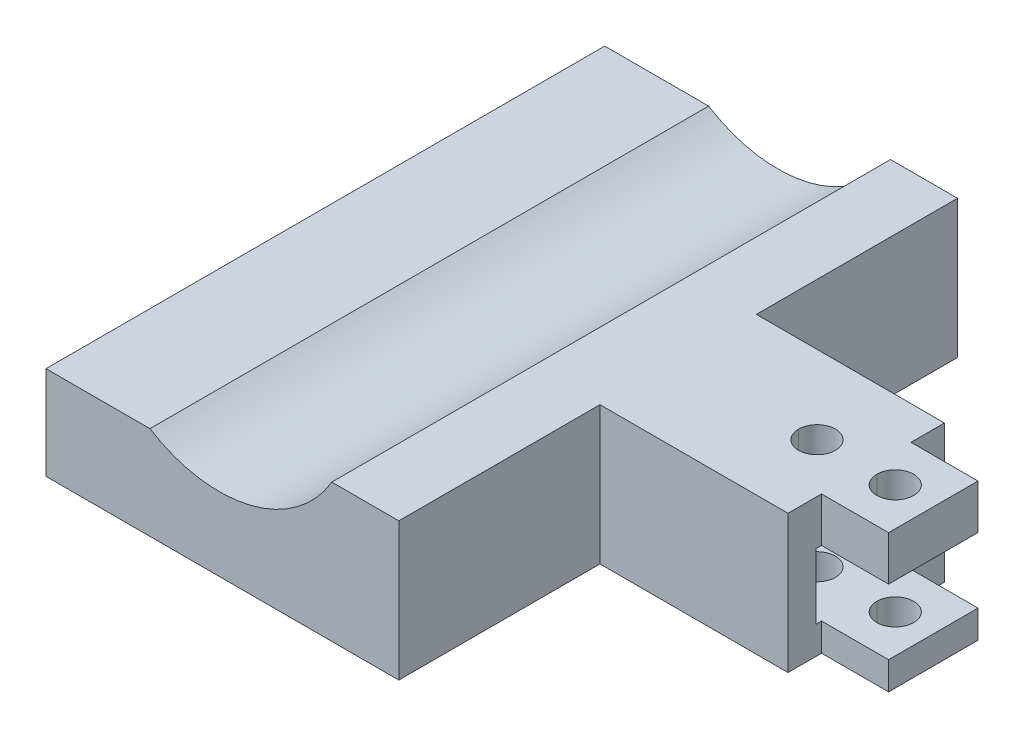
ISO-10303-21;
HEADER;
FILE_DESCRIPTION(('STEP AP214'),'2;1');
FILE_NAME('part.step','',(''),(''),'','','');
FILE_SCHEMA(('AUTOMOTIVE_DESIGN { 1 0 10303 214 1 1 1 1 }'));
ENDSEC;
DATA;
#1=APPLICATION_CONTEXT('core data for automotive mechanical design processes');
#2=APPLICATION_PROTOCOL_DEFINITION('international standard','automotive_design',2000,#1);
#3=PRODUCT_CONTEXT('',#1,'mechanical');
#4=PRODUCT('Part','Part','',(#3));
#5=PRODUCT_RELATED_PRODUCT_CATEGORY('part','',(#4));
#6=PRODUCT_DEFINITION_FORMATION('','',#4);
#7=PRODUCT_DEFINITION_CONTEXT('part definition',#1,'design');
#8=PRODUCT_DEFINITION('design','',#6,#7);
#9=PRODUCT_DEFINITION_SHAPE('','',#8);
#10=(LENGTH_UNIT() NAMED_UNIT(*) SI_UNIT(.MILLI.,.METRE.));
#11=(NAMED_UNIT(*) PLANE_ANGLE_UNIT() SI_UNIT($,.RADIAN.));
#12=(NAMED_UNIT(*) SI_UNIT($,.STERADIAN.) SOLID_ANGLE_UNIT());
#13=UNCERTAINTY_MEASURE_WITH_UNIT(LENGTH_MEASURE(1.E-05),#10,'distance_accuracy_value','');
#14=(GEOMETRIC_REPRESENTATION_CONTEXT(3) GLOBAL_UNCERTAINTY_ASSIGNED_CONTEXT((#13)) GLOBAL_UNIT_ASSIGNED_CONTEXT((#10,
#11,#12)) REPRESENTATION_CONTEXT('',''));
#15=CARTESIAN_POINT('',(0.,0.,0.));
#16=DIRECTION('',(0.,0.,1.));
#17=DIRECTION('',(1.,0.,0.));
#18=AXIS2_PLACEMENT_3D('',#15,#16,#17);
#19=CARTESIAN_POINT('',(-92.8945354558138,73.7864055622009,218.611735270425));
#20=DIRECTION('',(-1.,0.,0.));
#21=DIRECTION('',(0.,1.,0.));
#22=AXIS2_PLACEMENT_3D('',#19,#20,#21);
#23=PLANE('',#22);
#24=DIRECTION('',(0.,0.,1.));
#25=VECTOR('',#24,1.);
#26=CARTESIAN_POINT('',(-92.8945354558138,80.7864055622009,148.611735270425));
#27=LINE('',#26,#25);
#28=CARTESIAN_POINT('',(-92.8945354558149,80.7864055622009,189.611735270425));
#29=VERTEX_POINT('',#28);
#30=CARTESIAN_POINT('',(-92.8945354558138,80.7864055622009,197.611735270425));
#31=VERTEX_POINT('',#30);
#32=EDGE_CURVE('E314',#29,#31,#27,.T.);
#33=ORIENTED_EDGE('',*,*,#32,.F.);
#34=DIRECTION('',(0.,1.,0.));
#35=VECTOR('',#34,1.);
#36=CARTESIAN_POINT('',(-92.8945354558149,49.765319824315,189.611735270425));
#37=LINE('',#36,#35);
#38=CARTESIAN_POINT('',(-92.8945354558149,83.2834127928238,189.611735270425));
#39=VERTEX_POINT('',#38);
#40=EDGE_CURVE('E294',#29,#39,#37,.T.);
#41=ORIENTED_EDGE('',*,*,#40,.T.);
#42=DIRECTION('',(0.,0.,1.));
#43=VECTOR('',#42,1.);
#44=CARTESIAN_POINT('',(-92.8945354558138,83.2834127928238,218.611735270425));
#45=LINE('',#44,#43);
#46=CARTESIAN_POINT('',(-92.8945354558149,83.2834127928238,197.611735270425));
#47=VERTEX_POINT('',#46);
#48=EDGE_CURVE('E329',#39,#47,#45,.T.);
#49=ORIENTED_EDGE('',*,*,#48,.T.);
#50=DIRECTION('',(0.,1.,0.));
#51=VECTOR('',#50,1.);
#52=CARTESIAN_POINT('',(-92.8945354558149,49.765319824315,197.611735270425));
#53=LINE('',#52,#51);
#54=EDGE_CURVE('E320',#31,#47,#53,.T.);
#55=ORIENTED_EDGE('',*,*,#54,.F.);
#56=EDGE_LOOP('',(#33,#41,#49,#55));
#57=FACE_BOUND('',#56,.T.);
#58=ADVANCED_FACE('F53',(#57),#23,.F.);
#59=CARTESIAN_POINT('',(-109.894535455814,0.,0.));
#60=DIRECTION('',(1.,0.,0.));
#61=DIRECTION('',(0.,1.,0.));
#62=AXIS2_PLACEMENT_3D('',#59,#60,#61);
#63=PLANE('',#62);
#64=DIRECTION('',(0.,0.,1.));
#65=VECTOR('',#64,1.);
#66=CARTESIAN_POINT('',(-109.894535455814,83.2834127928238,218.611735270425));
#67=LINE('',#66,#65);
#68=CARTESIAN_POINT('',(-109.894535455814,83.2834127928238,189.118407463963));
#69=VERTEX_POINT('',#68);
#70=CARTESIAN_POINT('',(-109.894535455814,83.2834127928238,198.118407463963));
#71=VERTEX_POINT('',#70);
#72=EDGE_CURVE('E399',#69,#71,#67,.T.);
#73=ORIENTED_EDGE('',*,*,#72,.F.);
#74=DIRECTION('',(0.,-1.,0.));
#75=VECTOR('',#74,1.);
#76=CARTESIAN_POINT('',(-109.894535455814,73.7864055622009,189.118407463963));
#77=LINE('',#76,#75);
#78=CARTESIAN_POINT('',(-109.894535455814,89.1366751406176,189.118407463963));
#79=VERTEX_POINT('',#78);
#80=EDGE_CURVE('E346',#79,#69,#77,.T.);
#81=ORIENTED_EDGE('',*,*,#80,.F.);
#82=DIRECTION('',(0.,0.,-1.));
#83=VECTOR('',#82,1.);
#84=CARTESIAN_POINT('',(-109.894535455814,89.1366751406176,218.611735270425));
#85=LINE('',#84,#83);
#86=CARTESIAN_POINT('',(-109.894535455814,89.1366751406176,198.118407463963));
#87=VERTEX_POINT('',#86);
#88=EDGE_CURVE('E347',#87,#79,#85,.T.);
#89=ORIENTED_EDGE('',*,*,#88,.F.);
#90=DIRECTION('',(0.,-1.,0.));
#91=VECTOR('',#90,1.);
#92=CARTESIAN_POINT('',(-109.894535455814,73.7864055622009,198.118407463963));
#93=LINE('',#92,#91);
#94=EDGE_CURVE('E500',#87,#71,#93,.T.);
#95=ORIENTED_EDGE('',*,*,#94,.T.);
#96=EDGE_LOOP('',(#73,#81,#89,#95));
#97=FACE_BOUND('',#96,.T.);
#98=ADVANCED_FACE('F55',(#97),#63,.T.);
#99=CARTESIAN_POINT('',(-109.894535455814,73.7864055622009,189.118407463963));
#100=DIRECTION('',(0.,0.,1.));
#101=DIRECTION('',(1.,0.,0.));
#102=AXIS2_PLACEMENT_3D('',#99,#100,#101);
#103=PLANE('',#102);
#104=DIRECTION('',(0.,-1.,0.));
#105=VECTOR('',#104,1.);
#106=CARTESIAN_POINT('',(-98.8945354558149,73.7864055622009,189.118407463963));
#107=LINE('',#106,#105);
#108=CARTESIAN_POINT('',(-98.8945354558149,89.1366751406176,189.118407463963));
#109=VERTEX_POINT('',#108);
#110=CARTESIAN_POINT('',(-98.8945354558149,83.2834127928238,189.118407463963));
#111=VERTEX_POINT('',#110);
#112=EDGE_CURVE('E614',#109,#111,#107,.T.);
#113=ORIENTED_EDGE('',*,*,#112,.F.);
#114=DIRECTION('',(1.,0.,0.));
#115=VECTOR('',#114,1.);
#116=CARTESIAN_POINT('',(-109.894535455814,89.1366751406176,189.118407463963));
#117=LINE('',#116,#115);
#118=EDGE_CURVE('E342',#79,#109,#117,.T.);
#119=ORIENTED_EDGE('',*,*,#118,.F.);
#120=ORIENTED_EDGE('',*,*,#80,.T.);
#121=DIRECTION('',(1.,0.,0.));
#122=VECTOR('',#121,1.);
#123=CARTESIAN_POINT('',(-109.894535455814,83.2834127928238,189.118407463963));
#124=LINE('',#123,#122);
#125=EDGE_CURVE('E395',#69,#111,#124,.T.);
#126=ORIENTED_EDGE('',*,*,#125,.T.);
#127=EDGE_LOOP('',(#113,#119,#120,#126));
#128=FACE_BOUND('',#127,.T.);
#129=ADVANCED_FACE('F550',(#128),#103,.T.);
#130=CARTESIAN_POINT('',(-109.894535455814,89.1366751406176,218.611735270425));
#131=DIRECTION('',(0.,-1.,0.));
#132=DIRECTION('',(0.,0.,-1.));
#133=AXIS2_PLACEMENT_3D('',#130,#131,#132);
#134=PLANE('',#133);
#135=DIRECTION('',(-1.,0.,0.));
#136=VECTOR('',#135,1.);
#137=CARTESIAN_POINT('',(-109.894535455814,89.1366751406176,189.611735270425));
#138=LINE('',#137,#136);
#139=CARTESIAN_POINT('',(-92.8945354558149,89.1366751406176,189.611735270425));
#140=VERTEX_POINT('',#139);
#141=CARTESIAN_POINT('',(-98.8945354558149,89.1366751406176,189.611735270425));
#142=VERTEX_POINT('',#141);
#143=EDGE_CURVE('E592',#140,#142,#138,.T.);
#144=ORIENTED_EDGE('',*,*,#143,.F.);
#145=DIRECTION('',(0.,0.,-1.));
#146=VECTOR('',#145,1.);
#147=CARTESIAN_POINT('',(-92.8945354558138,89.1366751406176,218.611735270425));
#148=LINE('',#147,#146);
#149=CARTESIAN_POINT('',(-92.8945354558149,89.1366751406176,197.611735270425));
#150=VERTEX_POINT('',#149);
#151=EDGE_CURVE('E428',#150,#140,#148,.T.);
#152=ORIENTED_EDGE('',*,*,#151,.F.);
#153=DIRECTION('',(1.,0.,0.));
#154=VECTOR('',#153,1.);
#155=CARTESIAN_POINT('',(-109.894535455814,89.1366751406176,197.611735270425));
#156=LINE('',#155,#154);
#157=CARTESIAN_POINT('',(-98.8945354558149,89.1366751406176,197.611735270425));
#158=VERTEX_POINT('',#157);
#159=EDGE_CURVE('E590',#158,#150,#156,.T.);
#160=ORIENTED_EDGE('',*,*,#159,.F.);
#161=DIRECTION('',(0.,0.,-1.));
#162=VECTOR('',#161,1.);
#163=CARTESIAN_POINT('',(-98.8945354558149,89.1366751406176,218.611735270425));
#164=LINE('',#163,#162);
#165=CARTESIAN_POINT('',(-98.8945354558149,89.1366751406176,198.118407463963));
#166=VERTEX_POINT('',#165);
#167=EDGE_CURVE('E608',#166,#158,#164,.T.);
#168=ORIENTED_EDGE('',*,*,#167,.F.);
#169=DIRECTION('',(1.,0.,0.));
#170=VECTOR('',#169,1.);
#171=CARTESIAN_POINT('',(-109.894535455814,89.1366751406176,198.118407463963));
#172=LINE('',#171,#170);
#173=EDGE_CURVE('E503',#87,#166,#172,.T.);
#174=ORIENTED_EDGE('',*,*,#173,.F.);
#175=ORIENTED_EDGE('',*,*,#88,.T.);
#176=ORIENTED_EDGE('',*,*,#118,.T.);
#177=DIRECTION('',(0.,0.,-1.));
#178=VECTOR('',#177,1.);
#179=CARTESIAN_POINT('',(-98.8945354558149,89.1366751406176,218.611735270425));
#180=LINE('',#179,#178);
#181=EDGE_CURVE('E593',#142,#109,#180,.T.);
#182=ORIENTED_EDGE('',*,*,#181,.F.);
#183=EDGE_LOOP('',(#144,#152,#160,#168,#174,#175,#176,#182));
#184=FACE_BOUND('',#183,.T.);
#185=CARTESIAN_POINT('',(-103.3,89.1366751406176,193.611735270425));
#186=DIRECTION('',(0.,-1.,0.));
#187=DIRECTION('',(1.,0.,0.));
#188=AXIS2_PLACEMENT_3D('',#185,#186,#187);
#189=CIRCLE('',#188,1.65);
#190=CARTESIAN_POINT('',(-104.95,89.1366751406176,193.611735270425));
#191=VERTEX_POINT('',#190);
#192=CARTESIAN_POINT('',(-101.65,89.1366751406176,193.611735270425));
#193=VERTEX_POINT('',#192);
#194=EDGE_CURVE('E336',#191,#193,#189,.T.);
#195=ORIENTED_EDGE('',*,*,#194,.F.);
#196=CARTESIAN_POINT('',(-103.3,89.1366751406176,193.611735270425));
#197=DIRECTION('',(0.,-1.,0.));
#198=DIRECTION('',(1.,0.,0.));
#199=AXIS2_PLACEMENT_3D('',#196,#197,#198);
#200=CIRCLE('',#199,1.65);
#201=EDGE_CURVE('E445',#193,#191,#200,.T.);
#202=ORIENTED_EDGE('',*,*,#201,.F.);
#203=EDGE_LOOP('',(#195,#202));
#204=FACE_BOUND('',#203,.T.);
#205=CARTESIAN_POINT('',(-96.3,89.1366751406176,193.611735270425));
#206=DIRECTION('',(0.,-1.,0.));
#207=DIRECTION('',(1.,0.,0.));
#208=AXIS2_PLACEMENT_3D('',#205,#206,#207);
#209=CIRCLE('',#208,1.65);
#210=CARTESIAN_POINT('',(-97.95,89.1366751406176,193.611735270425));
#211=VERTEX_POINT('',#210);
#212=CARTESIAN_POINT('',(-94.65,89.1366751406176,193.611735270425));
#213=VERTEX_POINT('',#212);
#214=EDGE_CURVE('E387',#211,#213,#209,.T.);
#215=ORIENTED_EDGE('',*,*,#214,.F.);
#216=CARTESIAN_POINT('',(-96.3,89.1366751406176,193.611735270425));
#217=DIRECTION('',(0.,-1.,0.));
#218=DIRECTION('',(1.,0.,0.));
#219=AXIS2_PLACEMENT_3D('',#216,#217,#218);
#220=CIRCLE('',#219,1.65);
#221=EDGE_CURVE('E412',#213,#211,#220,.T.);
#222=ORIENTED_EDGE('',*,*,#221,.F.);
#223=EDGE_LOOP('',(#215,#222));
#224=FACE_BOUND('',#223,.T.);
#225=ADVANCED_FACE('F547',(#184,#204,#224),#134,.T.);
#226=CARTESIAN_POINT('',(-109.894535455814,73.7864055622009,198.118407463963));
#227=DIRECTION('',(0.,0.,1.));
#228=DIRECTION('',(1.,0.,0.));
#229=AXIS2_PLACEMENT_3D('',#226,#227,#228);
#230=PLANE('',#229);
#231=ORIENTED_EDGE('',*,*,#173,.T.);
#232=DIRECTION('',(0.,-1.,0.));
#233=VECTOR('',#232,1.);
#234=CARTESIAN_POINT('',(-98.8945354558149,73.7864055622009,198.118407463963));
#235=LINE('',#234,#233);
#236=CARTESIAN_POINT('',(-98.8945354558149,83.2834127928238,198.118407463963));
#237=VERTEX_POINT('',#236);
#238=EDGE_CURVE('E600',#166,#237,#235,.T.);
#239=ORIENTED_EDGE('',*,*,#238,.T.);
#240=DIRECTION('',(1.,0.,0.));
#241=VECTOR('',#240,1.);
#242=CARTESIAN_POINT('',(-109.894535455814,83.2834127928238,198.118407463963));
#243=LINE('',#242,#241);
#244=EDGE_CURVE('E496',#71,#237,#243,.T.);
#245=ORIENTED_EDGE('',*,*,#244,.F.);
#246=ORIENTED_EDGE('',*,*,#94,.F.);
#247=EDGE_LOOP('',(#231,#239,#245,#246));
#248=FACE_BOUND('',#247,.T.);
#249=ADVANCED_FACE('F543',(#248),#230,.F.);
#250=CARTESIAN_POINT('',(-109.894535455814,83.2834127928238,218.611735270425));
#251=DIRECTION('',(0.,1.,0.));
#252=DIRECTION('',(1.,0.,0.));
#253=AXIS2_PLACEMENT_3D('',#250,#251,#252);
#254=PLANE('',#253);
#255=DIRECTION('',(1.,0.,0.));
#256=VECTOR('',#255,1.);
#257=CARTESIAN_POINT('',(-109.894535455814,83.2834127928238,189.611735270425));
#258=LINE('',#257,#256);
#259=CARTESIAN_POINT('',(-98.8945354558149,83.2834127928238,189.611735270425));
#260=VERTEX_POINT('',#259);
#261=EDGE_CURVE('E301',#260,#39,#258,.T.);
#262=ORIENTED_EDGE('',*,*,#261,.F.);
#263=DIRECTION('',(0.,0.,1.));
#264=VECTOR('',#263,1.);
#265=CARTESIAN_POINT('',(-98.8945354558149,83.2834127928238,218.611735270425));
#266=LINE('',#265,#264);
#267=EDGE_CURVE('E611',#111,#260,#266,.T.);
#268=ORIENTED_EDGE('',*,*,#267,.F.);
#269=ORIENTED_EDGE('',*,*,#125,.F.);
#270=ORIENTED_EDGE('',*,*,#72,.T.);
#271=ORIENTED_EDGE('',*,*,#244,.T.);
#272=DIRECTION('',(0.,0.,1.));
#273=VECTOR('',#272,1.);
#274=CARTESIAN_POINT('',(-98.8945354558149,83.2834127928238,218.611735270425));
#275=LINE('',#274,#273);
#276=CARTESIAN_POINT('',(-98.8945354558149,83.2834127928238,197.611735270425));
#277=VERTEX_POINT('',#276);
#278=EDGE_CURVE('E596',#277,#237,#275,.T.);
#279=ORIENTED_EDGE('',*,*,#278,.F.);
#280=DIRECTION('',(-1.,0.,0.));
#281=VECTOR('',#280,1.);
#282=CARTESIAN_POINT('',(-109.894535455814,83.2834127928238,197.611735270425));
#283=LINE('',#282,#281);
#284=EDGE_CURVE('E663',#47,#277,#283,.T.);
#285=ORIENTED_EDGE('',*,*,#284,.F.);
#286=ORIENTED_EDGE('',*,*,#48,.F.);
#287=EDGE_LOOP('',(#262,#268,#269,#270,#271,#279,#285,#286));
#288=FACE_BOUND('',#287,.T.);
#289=CARTESIAN_POINT('',(-103.3,83.2834127928238,193.611735270425));
#290=DIRECTION('',(0.,1.,0.));
#291=DIRECTION('',(-1.,0.,0.));
#292=AXIS2_PLACEMENT_3D('',#289,#290,#291);
#293=CIRCLE('',#292,1.65);
#294=CARTESIAN_POINT('',(-104.95,83.2834127928238,193.611735270425));
#295=VERTEX_POINT('',#294);
#296=CARTESIAN_POINT('',(-101.65,83.2834127928238,193.611735270425));
#297=VERTEX_POINT('',#296);
#298=EDGE_CURVE('E442',#295,#297,#293,.T.);
#299=ORIENTED_EDGE('',*,*,#298,.F.);
#300=CARTESIAN_POINT('',(-103.3,83.2834127928238,193.611735270425));
#301=DIRECTION('',(0.,1.,0.));
#302=DIRECTION('',(-1.,0.,0.));
#303=AXIS2_PLACEMENT_3D('',#300,#301,#302);
#304=CIRCLE('',#303,1.65);
#305=EDGE_CURVE('E357',#297,#295,#304,.T.);
#306=ORIENTED_EDGE('',*,*,#305,.F.);
#307=EDGE_LOOP('',(#299,#306));
#308=FACE_BOUND('',#307,.T.);
#309=CARTESIAN_POINT('',(-96.3,83.2834127928238,193.611735270425));
#310=DIRECTION('',(0.,1.,0.));
#311=DIRECTION('',(-1.,0.,0.));
#312=AXIS2_PLACEMENT_3D('',#309,#310,#311);
#313=CIRCLE('',#312,1.65);
#314=CARTESIAN_POINT('',(-97.95,83.2834127928238,193.611735270425));
#315=VERTEX_POINT('',#314);
#316=CARTESIAN_POINT('',(-94.65,83.2834127928238,193.611735270425));
#317=VERTEX_POINT('',#316);
#318=EDGE_CURVE('E441',#315,#317,#313,.T.);
#319=ORIENTED_EDGE('',*,*,#318,.F.);
#320=CARTESIAN_POINT('',(-96.3,83.2834127928238,193.611735270425));
#321=DIRECTION('',(0.,1.,0.));
#322=DIRECTION('',(-1.,0.,0.));
#323=AXIS2_PLACEMENT_3D('',#320,#321,#322);
#324=CIRCLE('',#323,1.65);
#325=EDGE_CURVE('E332',#317,#315,#324,.T.);
#326=ORIENTED_EDGE('',*,*,#325,.F.);
#327=EDGE_LOOP('',(#319,#326));
#328=FACE_BOUND('',#327,.T.);
#329=ADVANCED_FACE('F540',(#288,#308,#328),#254,.T.);
#330=CARTESIAN_POINT('',(-92.8945354558138,80.7864055622009,148.611735270425));
#331=DIRECTION('',(0.,-1.,0.));
#332=DIRECTION('',(0.,0.,-1.));
#333=AXIS2_PLACEMENT_3D('',#330,#331,#332);
#334=PLANE('',#333);
#335=DIRECTION('',(1.,0.,0.));
#336=VECTOR('',#335,1.);
#337=CARTESIAN_POINT('',(-98.8945354558149,80.7864055622009,189.611735270425));
#338=LINE('',#337,#336);
#339=CARTESIAN_POINT('',(-98.8945354558149,80.7864055622009,189.611735270425));
#340=VERTEX_POINT('',#339);
#341=EDGE_CURVE('E298',#340,#29,#338,.T.);
#342=ORIENTED_EDGE('',*,*,#341,.T.);
#343=ORIENTED_EDGE('',*,*,#32,.T.);
#344=DIRECTION('',(-1.,0.,0.));
#345=VECTOR('',#344,1.);
#346=CARTESIAN_POINT('',(-98.8945354558149,80.7864055622009,197.611735270425));
#347=LINE('',#346,#345);
#348=CARTESIAN_POINT('',(-98.8945354558149,80.7864055622009,197.611735270425));
#349=VERTEX_POINT('',#348);
#350=EDGE_CURVE('E76',#31,#349,#347,.T.);
#351=ORIENTED_EDGE('',*,*,#350,.T.);
#352=DIRECTION('',(0.,0.,1.));
#353=VECTOR('',#352,1.);
#354=CARTESIAN_POINT('',(-98.8945354558149,80.7864055622009,197.611735270425));
#355=LINE('',#354,#353);
#356=CARTESIAN_POINT('',(-98.8945354558149,80.7864055622009,200.611735270425));
#357=VERTEX_POINT('',#356);
#358=EDGE_CURVE('E652',#349,#357,#355,.T.);
#359=ORIENTED_EDGE('',*,*,#358,.T.);
#360=DIRECTION('',(-1.,0.,0.));
#361=VECTOR('',#360,1.);
#362=CARTESIAN_POINT('',(-98.8945354558149,80.7864055622009,200.611735270425));
#363=LINE('',#362,#361);
#364=CARTESIAN_POINT('',(-115.726700494577,80.7864055622009,200.611735270425));
#365=VERTEX_POINT('',#364);
#366=EDGE_CURVE('E685',#357,#365,#363,.T.);
#367=ORIENTED_EDGE('',*,*,#366,.T.);
#368=DIRECTION('',(0.,0.,1.));
#369=VECTOR('',#368,1.);
#370=CARTESIAN_POINT('',(-115.726700494577,80.7864055622009,200.611735270425));
#371=LINE('',#370,#369);
#372=CARTESIAN_POINT('',(-115.726700494577,80.7864055622009,218.611735270425));
#373=VERTEX_POINT('',#372);
#374=EDGE_CURVE('E689',#365,#373,#371,.T.);
#375=ORIENTED_EDGE('',*,*,#374,.T.);
#376=DIRECTION('',(1.,0.,0.));
#377=VECTOR('',#376,1.);
#378=CARTESIAN_POINT('',(-92.8945354558138,80.7864055622009,218.611735270425));
#379=LINE('',#378,#377);
#380=CARTESIAN_POINT('',(-147.3,80.7864055622009,218.611735270425));
#381=VERTEX_POINT('',#380);
#382=EDGE_CURVE('E429',#381,#373,#379,.T.);
#383=ORIENTED_EDGE('',*,*,#382,.F.);
#384=DIRECTION('',(0.,0.,1.));
#385=VECTOR('',#384,1.);
#386=CARTESIAN_POINT('',(-147.3,80.7864055622009,148.611735270425));
#387=LINE('',#386,#385);
#388=CARTESIAN_POINT('',(-147.3,80.7864055622009,168.611735270425));
#389=VERTEX_POINT('',#388);
#390=EDGE_CURVE('E420',#389,#381,#387,.T.);
#391=ORIENTED_EDGE('',*,*,#390,.F.);
#392=DIRECTION('',(1.,0.,0.));
#393=VECTOR('',#392,1.);
#394=CARTESIAN_POINT('',(-92.8945354558138,80.7864055622009,168.611735270425));
#395=LINE('',#394,#393);
#396=CARTESIAN_POINT('',(-115.726700494577,80.7864055622009,168.611735270425));
#397=VERTEX_POINT('',#396);
#398=EDGE_CURVE('E421',#389,#397,#395,.T.);
#399=ORIENTED_EDGE('',*,*,#398,.T.);
#400=DIRECTION('',(0.,0.,1.));
#401=VECTOR('',#400,1.);
#402=CARTESIAN_POINT('',(-115.726700494577,80.7864055622009,168.611735270425));
#403=LINE('',#402,#401);
#404=CARTESIAN_POINT('',(-115.726700494577,80.7864055622009,186.611735270425));
#405=VERTEX_POINT('',#404);
#406=EDGE_CURVE('E725',#397,#405,#403,.T.);
#407=ORIENTED_EDGE('',*,*,#406,.T.);
#408=DIRECTION('',(1.,0.,0.));
#409=VECTOR('',#408,1.);
#410=CARTESIAN_POINT('',(-115.726700494577,80.7864055622009,186.611735270425));
#411=LINE('',#410,#409);
#412=CARTESIAN_POINT('',(-98.8945354558149,80.7864055622009,186.611735270425));
#413=VERTEX_POINT('',#412);
#414=EDGE_CURVE('E721',#405,#413,#411,.T.);
#415=ORIENTED_EDGE('',*,*,#414,.T.);
#416=DIRECTION('',(0.,0.,1.));
#417=VECTOR('',#416,1.);
#418=CARTESIAN_POINT('',(-98.8945354558149,80.7864055622009,186.611735270425));
#419=LINE('',#418,#417);
#420=EDGE_CURVE('E316',#413,#340,#419,.T.);
#421=ORIENTED_EDGE('',*,*,#420,.T.);
#422=EDGE_LOOP('',(#342,#343,#351,#359,#367,#375,#383,#391,#399,#407,#415,#421));
#423=FACE_BOUND('',#422,.T.);
#424=CARTESIAN_POINT('',(-96.3,80.7864055622009,193.611735270425));
#425=DIRECTION('',(0.,-1.,0.));
#426=DIRECTION('',(0.,0.,-1.));
#427=AXIS2_PLACEMENT_3D('',#424,#425,#426);
#428=CIRCLE('',#427,1.65);
#429=CARTESIAN_POINT('',(-97.95,80.7864055622009,193.611735270425));
#430=VERTEX_POINT('',#429);
#431=CARTESIAN_POINT('',(-94.65,80.7864055622009,193.611735270425));
#432=VERTEX_POINT('',#431);
#433=EDGE_CURVE('E363',#430,#432,#428,.T.);
#434=ORIENTED_EDGE('',*,*,#433,.F.);
#435=CARTESIAN_POINT('',(-96.3,80.7864055622009,193.611735270425));
#436=DIRECTION('',(0.,-1.,0.));
#437=DIRECTION('',(0.,0.,-1.));
#438=AXIS2_PLACEMENT_3D('',#435,#436,#437);
#439=CIRCLE('',#438,1.65);
#440=EDGE_CURVE('E438',#432,#430,#439,.T.);
#441=ORIENTED_EDGE('',*,*,#440,.F.);
#442=EDGE_LOOP('',(#434,#441));
#443=FACE_BOUND('',#442,.T.);
#444=CARTESIAN_POINT('',(-103.3,80.7864055622009,193.611735270425));
#445=DIRECTION('',(0.,-1.,0.));
#446=DIRECTION('',(0.,0.,-1.));
#447=AXIS2_PLACEMENT_3D('',#444,#445,#446);
#448=CIRCLE('',#447,1.65);
#449=CARTESIAN_POINT('',(-104.95,80.7864055622009,193.611735270425));
#450=VERTEX_POINT('',#449);
#451=CARTESIAN_POINT('',(-101.65,80.7864055622009,193.611735270425));
#452=VERTEX_POINT('',#451);
#453=EDGE_CURVE('E358',#450,#452,#448,.T.);
#454=ORIENTED_EDGE('',*,*,#453,.F.);
#455=CARTESIAN_POINT('',(-103.3,80.7864055622009,193.611735270425));
#456=DIRECTION('',(0.,-1.,0.));
#457=DIRECTION('',(0.,0.,-1.));
#458=AXIS2_PLACEMENT_3D('',#455,#456,#457);
#459=CIRCLE('',#458,1.65);
#460=EDGE_CURVE('E411',#452,#450,#459,.T.);
#461=ORIENTED_EDGE('',*,*,#460,.F.);
#462=EDGE_LOOP('',(#454,#461));
#463=FACE_BOUND('',#462,.T.);
#464=ADVANCED_FACE('F312',(#423,#443,#463),#334,.T.);
#465=CARTESIAN_POINT('',(-1.24630924646443,-1.9391771083637,250.857507780141));
#466=DIRECTION('',(0.540664086034655,0.841238578568715,0.));
#467=DIRECTION('',(0.,0.,-1.));
#468=AXIS2_PLACEMENT_3D('',#465,#466,#467);
#469=PLANE('',#468);
#470=CARTESIAN_POINT('',(-131.801673462015,99.0335264529981,210.611735270425));
#471=DIRECTION('',(0.,0.,1.));
#472=DIRECTION('',(-0.553398676430953,-0.83291650537402,0.));
#473=AXIS2_PLACEMENT_3D('',#470,#471,#472);
#474=CIRCLE('',#473,14.3571982671494);
#475=CARTESIAN_POINT('',(-139.746927980312,87.0751790453629,210.611735270425));
#476=VERTEX_POINT('',#475);
#477=CARTESIAN_POINT('',(-139.379465470443,86.8390108677353,210.611735270425));
#478=VERTEX_POINT('',#477);
#479=EDGE_CURVE('E490',#476,#478,#474,.T.);
#480=ORIENTED_EDGE('',*,*,#479,.F.);
#481=DIRECTION('',(0.,0.,1.));
#482=VECTOR('',#481,1.);
#483=CARTESIAN_POINT('',(-139.746927980312,87.0751790453629,168.611735270425));
#484=LINE('',#483,#482);
#485=CARTESIAN_POINT('',(-139.746927980312,87.0751790453629,168.611735270425));
#486=VERTEX_POINT('',#485);
#487=EDGE_CURVE('E768',#486,#476,#484,.T.);
#488=ORIENTED_EDGE('',*,*,#487,.F.);
#489=DIRECTION('',(0.841238578568715,-0.540664086034655,0.));
#490=VECTOR('',#489,1.);
#491=CARTESIAN_POINT('',(-1.24630924646443,-1.9391771083637,168.611735270425));
#492=LINE('',#491,#490);
#493=CARTESIAN_POINT('',(-139.379465470443,86.8390108677353,168.611735270425));
#494=VERTEX_POINT('',#493);
#495=EDGE_CURVE('E476',#486,#494,#492,.T.);
#496=ORIENTED_EDGE('',*,*,#495,.T.);
#497=DIRECTION('',(0.,0.,1.));
#498=VECTOR('',#497,1.);
#499=CARTESIAN_POINT('',(-139.379465470392,86.8390108677022,210.611735270425));
#500=LINE('',#499,#498);
#501=EDGE_CURVE('E419',#494,#478,#500,.T.);
#502=ORIENTED_EDGE('',*,*,#501,.T.);
#503=EDGE_LOOP('',(#480,#488,#496,#502));
#504=FACE_BOUND('',#503,.T.);
#505=ADVANCED_FACE('F538',(#504),#469,.F.);
#506=CARTESIAN_POINT('',(-131.801673462013,99.0335264529981,150.79859842346));
#507=DIRECTION('',(0.,0.,1.));
#508=DIRECTION('',(1.,0.,0.));
#509=AXIS2_PLACEMENT_3D('',#506,#507,#508);
#510=CYLINDRICAL_SURFACE('',#509,11.6768418612909);
#511=CARTESIAN_POINT('',(-131.801673462013,99.0335264529981,168.611735270425));
#512=DIRECTION('',(0.,0.,1.));
#513=DIRECTION('',(0.,-1.,0.));
#514=AXIS2_PLACEMENT_3D('',#511,#512,#513);
#515=CIRCLE('',#514,11.6768418612909);
#516=CARTESIAN_POINT('',(-137.998525078297,89.1366751406183,168.611735270425));
#517=VERTEX_POINT('',#516);
#518=CARTESIAN_POINT('',(-121.726700494577,93.1306834465295,168.611735270425));
#519=VERTEX_POINT('',#518);
#520=EDGE_CURVE('E471',#517,#519,#515,.T.);
#521=ORIENTED_EDGE('',*,*,#520,.F.);
#522=DIRECTION('',(0.,0.,1.));
#523=VECTOR('',#522,1.);
#524=CARTESIAN_POINT('',(-137.998525078297,89.1366751406183,150.79859842346));
#525=LINE('',#524,#523);
#526=CARTESIAN_POINT('',(-137.998525078297,89.1366751406183,218.611735270425));
#527=VERTEX_POINT('',#526);
#528=EDGE_CURVE('E400',#517,#527,#525,.T.);
#529=ORIENTED_EDGE('',*,*,#528,.T.);
#530=CARTESIAN_POINT('',(-131.801673462013,99.0335264529981,218.611735270425));
#531=DIRECTION('',(0.,0.,-1.));
#532=DIRECTION('',(1.,0.,0.));
#533=AXIS2_PLACEMENT_3D('',#530,#531,#532);
#534=CIRCLE('',#533,11.6768418612909);
#535=CARTESIAN_POINT('',(-121.726700494577,93.1306834465295,218.611735270425));
#536=VERTEX_POINT('',#535);
#537=EDGE_CURVE('E383',#536,#527,#534,.T.);
#538=ORIENTED_EDGE('',*,*,#537,.F.);
#539=DIRECTION('',(0.,0.,1.));
#540=VECTOR('',#539,1.);
#541=CARTESIAN_POINT('',(-121.726700494577,93.1306834465295,150.79859842346));
#542=LINE('',#541,#540);
#543=EDGE_CURVE('E486',#519,#536,#542,.T.);
#544=ORIENTED_EDGE('',*,*,#543,.F.);
#545=EDGE_LOOP('',(#521,#529,#538,#544));
#546=FACE_BOUND('',#545,.T.);
#547=ADVANCED_FACE('F534',(#546),#510,.F.);
#548=CARTESIAN_POINT('',(-139.835441264561,89.1366751406183,210.611735270425));
#549=DIRECTION('',(0.,1.,0.));
#550=DIRECTION('',(1.,0.,0.));
#551=AXIS2_PLACEMENT_3D('',#548,#549,#550);
#552=PLANE('',#551);
#553=DIRECTION('',(1.,0.,0.));
#554=VECTOR('',#553,1.);
#555=CARTESIAN_POINT('',(-138.294361861346,89.1366751406183,168.611735270425));
#556=LINE('',#555,#554);
#557=CARTESIAN_POINT('',(-147.3,89.1366751406183,168.611735270425));
#558=VERTEX_POINT('',#557);
#559=EDGE_CURVE('E467',#558,#517,#556,.T.);
#560=ORIENTED_EDGE('',*,*,#559,.F.);
#561=DIRECTION('',(0.,0.,1.));
#562=VECTOR('',#561,1.);
#563=CARTESIAN_POINT('',(-147.300000000001,89.1366751406176,210.611735270425));
#564=LINE('',#563,#562);
#565=CARTESIAN_POINT('',(-147.300000000001,89.1366751406176,218.611735270425));
#566=VERTEX_POINT('',#565);
#567=EDGE_CURVE('E416',#558,#566,#564,.T.);
#568=ORIENTED_EDGE('',*,*,#567,.T.);
#569=DIRECTION('',(-1.,0.,0.));
#570=VECTOR('',#569,1.);
#571=CARTESIAN_POINT('',(-139.835441264561,89.1366751406183,218.611735270425));
#572=LINE('',#571,#570);
#573=EDGE_CURVE('E378',#527,#566,#572,.T.);
#574=ORIENTED_EDGE('',*,*,#573,.F.);
#575=ORIENTED_EDGE('',*,*,#528,.F.);
#576=EDGE_LOOP('',(#560,#568,#574,#575));
#577=FACE_BOUND('',#576,.T.);
#578=ADVANCED_FACE('F537',(#577),#552,.T.);
#579=CARTESIAN_POINT('',(0.,93.1306834465294,168.611735270425));
#580=DIRECTION('',(0.,1.,0.));
#581=DIRECTION('',(1.,0.,0.));
#582=AXIS2_PLACEMENT_3D('',#579,#580,#581);
#583=PLANE('',#582);
#584=DIRECTION('',(1.,0.,0.));
#585=VECTOR('',#584,1.);
#586=CARTESIAN_POINT('',(-98.8945354558149,93.1306834465294,189.611735270425));
#587=LINE('',#586,#585);
#588=CARTESIAN_POINT('',(-98.8945354558149,93.1306834465294,189.611735270425));
#589=VERTEX_POINT('',#588);
#590=CARTESIAN_POINT('',(-92.8945354558149,93.1306834465294,189.611735270425));
#591=VERTEX_POINT('',#590);
#592=EDGE_CURVE('E69',#589,#591,#587,.T.);
#593=ORIENTED_EDGE('',*,*,#592,.F.);
#594=DIRECTION('',(0.,0.,1.));
#595=VECTOR('',#594,1.);
#596=CARTESIAN_POINT('',(-98.8945354558149,93.1306834465294,186.611735270425));
#597=LINE('',#596,#595);
#598=CARTESIAN_POINT('',(-98.8945354558149,93.1306834465294,186.611735270425));
#599=VERTEX_POINT('',#598);
#600=EDGE_CURVE('E703',#599,#589,#597,.T.);
#601=ORIENTED_EDGE('',*,*,#600,.F.);
#602=DIRECTION('',(1.,0.,0.));
#603=VECTOR('',#602,1.);
#604=CARTESIAN_POINT('',(-115.726700494577,93.1306834465294,186.611735270425));
#605=LINE('',#604,#603);
#606=CARTESIAN_POINT('',(-115.726700494577,93.1306834465294,186.611735270425));
#607=VERTEX_POINT('',#606);
#608=EDGE_CURVE('E318',#607,#599,#605,.T.);
#609=ORIENTED_EDGE('',*,*,#608,.F.);
#610=DIRECTION('',(0.,0.,1.));
#611=VECTOR('',#610,1.);
#612=CARTESIAN_POINT('',(-115.726700494577,93.1306834465294,168.611735270425));
#613=LINE('',#612,#611);
#614=CARTESIAN_POINT('',(-115.726700494577,93.1306834465294,168.611735270425));
#615=VERTEX_POINT('',#614);
#616=EDGE_CURVE('E629',#615,#607,#613,.T.);
#617=ORIENTED_EDGE('',*,*,#616,.F.);
#618=DIRECTION('',(-1.,0.,0.));
#619=VECTOR('',#618,1.);
#620=CARTESIAN_POINT('',(0.,93.1306834465294,168.611735270425));
#621=LINE('',#620,#619);
#622=EDGE_CURVE('E475',#615,#519,#621,.T.);
#623=ORIENTED_EDGE('',*,*,#622,.T.);
#624=ORIENTED_EDGE('',*,*,#543,.T.);
#625=DIRECTION('',(-1.,0.,0.));
#626=VECTOR('',#625,1.);
#627=CARTESIAN_POINT('',(0.,93.1306834465294,218.611735270425));
#628=LINE('',#627,#626);
#629=CARTESIAN_POINT('',(-115.726700494577,93.1306834465294,218.611735270425));
#630=VERTEX_POINT('',#629);
#631=EDGE_CURVE('E433',#630,#536,#628,.T.);
#632=ORIENTED_EDGE('',*,*,#631,.F.);
#633=DIRECTION('',(0.,0.,1.));
#634=VECTOR('',#633,1.);
#635=CARTESIAN_POINT('',(-115.726700494577,93.1306834465294,200.611735270425));
#636=LINE('',#635,#634);
#637=CARTESIAN_POINT('',(-115.726700494577,93.1306834465294,200.611735270425));
#638=VERTEX_POINT('',#637);
#639=EDGE_CURVE('E646',#638,#630,#636,.T.);
#640=ORIENTED_EDGE('',*,*,#639,.F.);
#641=DIRECTION('',(-1.,0.,0.));
#642=VECTOR('',#641,1.);
#643=CARTESIAN_POINT('',(-98.8945354558149,93.1306834465294,200.611735270425));
#644=LINE('',#643,#642);
#645=CARTESIAN_POINT('',(-98.8945354558149,93.1306834465294,200.611735270425));
#646=VERTEX_POINT('',#645);
#647=EDGE_CURVE('E649',#646,#638,#644,.T.);
#648=ORIENTED_EDGE('',*,*,#647,.F.);
#649=DIRECTION('',(0.,0.,1.));
#650=VECTOR('',#649,1.);
#651=CARTESIAN_POINT('',(-98.8945354558149,93.1306834465294,197.611735270425));
#652=LINE('',#651,#650);
#653=CARTESIAN_POINT('',(-98.8945354558149,93.1306834465294,197.611735270425));
#654=VERTEX_POINT('',#653);
#655=EDGE_CURVE('E656',#654,#646,#652,.T.);
#656=ORIENTED_EDGE('',*,*,#655,.F.);
#657=DIRECTION('',(-1.,0.,0.));
#658=VECTOR('',#657,1.);
#659=CARTESIAN_POINT('',(-98.8945354558149,93.1306834465294,197.611735270425));
#660=LINE('',#659,#658);
#661=CARTESIAN_POINT('',(-92.8945354558149,93.1306834465294,197.611735270425));
#662=VERTEX_POINT('',#661);
#663=EDGE_CURVE('E673',#662,#654,#660,.T.);
#664=ORIENTED_EDGE('',*,*,#663,.F.);
#665=DIRECTION('',(0.,0.,1.));
#666=VECTOR('',#665,1.);
#667=CARTESIAN_POINT('',(-92.8945354558149,93.1306834465294,151.441035287217));
#668=LINE('',#667,#666);
#669=EDGE_CURVE('E322',#591,#662,#668,.T.);
#670=ORIENTED_EDGE('',*,*,#669,.F.);
#671=EDGE_LOOP('',(#593,#601,#609,#617,#623,#624,#632,#640,#648,#656,#664,#670));
#672=FACE_BOUND('',#671,.T.);
#673=CARTESIAN_POINT('',(-96.3,93.1306834465295,193.611735270425));
#674=DIRECTION('',(0.,-1.,0.));
#675=DIRECTION('',(0.,0.,-1.));
#676=AXIS2_PLACEMENT_3D('',#673,#674,#675);
#677=CIRCLE('',#676,1.65);
#678=CARTESIAN_POINT('',(-97.95,93.1306834465295,193.611735270425));
#679=VERTEX_POINT('',#678);
#680=CARTESIAN_POINT('',(-94.65,93.1306834465295,193.611735270425));
#681=VERTEX_POINT('',#680);
#682=EDGE_CURVE('E404',#679,#681,#677,.T.);
#683=ORIENTED_EDGE('',*,*,#682,.T.);
#684=CARTESIAN_POINT('',(-96.3,93.1306834465295,193.611735270425));
#685=DIRECTION('',(0.,-1.,0.));
#686=DIRECTION('',(0.,0.,-1.));
#687=AXIS2_PLACEMENT_3D('',#684,#685,#686);
#688=CIRCLE('',#687,1.65);
#689=EDGE_CURVE('E408',#681,#679,#688,.T.);
#690=ORIENTED_EDGE('',*,*,#689,.T.);
#691=EDGE_LOOP('',(#683,#690));
#692=FACE_BOUND('',#691,.T.);
#693=CARTESIAN_POINT('',(-103.3,93.1306834465295,193.611735270425));
#694=DIRECTION('',(0.,-1.,0.));
#695=DIRECTION('',(0.,0.,-1.));
#696=AXIS2_PLACEMENT_3D('',#693,#694,#695);
#697=CIRCLE('',#696,1.65);
#698=CARTESIAN_POINT('',(-104.95,93.1306834465295,193.611735270425));
#699=VERTEX_POINT('',#698);
#700=CARTESIAN_POINT('',(-101.65,93.1306834465295,193.611735270425));
#701=VERTEX_POINT('',#700);
#702=EDGE_CURVE('E352',#699,#701,#697,.T.);
#703=ORIENTED_EDGE('',*,*,#702,.T.);
#704=CARTESIAN_POINT('',(-103.3,93.1306834465295,193.611735270425));
#705=DIRECTION('',(0.,-1.,0.));
#706=DIRECTION('',(0.,0.,-1.));
#707=AXIS2_PLACEMENT_3D('',#704,#705,#706);
#708=CIRCLE('',#707,1.65);
#709=EDGE_CURVE('E434',#701,#699,#708,.T.);
#710=ORIENTED_EDGE('',*,*,#709,.T.);
#711=EDGE_LOOP('',(#703,#710));
#712=FACE_BOUND('',#711,.T.);
#713=ADVANCED_FACE('F532',(#672,#692,#712),#583,.T.);
#714=CARTESIAN_POINT('',(-131.801673462015,99.0335264529981,210.611735270425));
#715=DIRECTION('',(0.,0.,1.));
#716=DIRECTION('',(1.,0.,0.));
#717=AXIS2_PLACEMENT_3D('',#714,#715,#716);
#718=CYLINDRICAL_SURFACE('',#717,14.3571982671494);
#719=ORIENTED_EDGE('',*,*,#501,.F.);
#720=CARTESIAN_POINT('',(-131.801673462015,99.0335264529981,168.611735270425));
#721=DIRECTION('',(0.,0.,-1.));
#722=DIRECTION('',(1.,0.,0.));
#723=AXIS2_PLACEMENT_3D('',#720,#721,#722);
#724=CIRCLE('',#723,14.3571982671484);
#725=EDGE_CURVE('E480',#494,#486,#724,.T.);
#726=ORIENTED_EDGE('',*,*,#725,.T.);
#727=ORIENTED_EDGE('',*,*,#487,.T.);
#728=ORIENTED_EDGE('',*,*,#479,.T.);
#729=EDGE_LOOP('',(#719,#726,#727,#728));
#730=FACE_BOUND('',#729,.T.);
#731=ADVANCED_FACE('F521',(#730),#718,.F.);
#732=CARTESIAN_POINT('',(-147.3,73.7864055622009,168.611735270425));
#733=DIRECTION('',(1.,0.,0.));
#734=DIRECTION('',(0.,0.,1.));
#735=AXIS2_PLACEMENT_3D('',#732,#733,#734);
#736=PLANE('',#735);
#737=ORIENTED_EDGE('',*,*,#390,.T.);
#738=DIRECTION('',(0.,1.,0.));
#739=VECTOR('',#738,1.);
#740=CARTESIAN_POINT('',(-147.3,73.7864055622009,218.611735270425));
#741=LINE('',#740,#739);
#742=EDGE_CURVE('E382',#381,#566,#741,.T.);
#743=ORIENTED_EDGE('',*,*,#742,.T.);
#744=ORIENTED_EDGE('',*,*,#567,.F.);
#745=DIRECTION('',(0.,1.,0.));
#746=VECTOR('',#745,1.);
#747=CARTESIAN_POINT('',(-147.3,73.7864055622009,168.611735270425));
#748=LINE('',#747,#746);
#749=EDGE_CURVE('E424',#389,#558,#748,.T.);
#750=ORIENTED_EDGE('',*,*,#749,.F.);
#751=EDGE_LOOP('',(#737,#743,#744,#750));
#752=FACE_BOUND('',#751,.T.);
#753=ADVANCED_FACE('F531',(#752),#736,.F.);
#754=CARTESIAN_POINT('',(-92.8945354558138,73.7864055622009,168.611735270425));
#755=DIRECTION('',(0.,0.,1.));
#756=DIRECTION('',(0.,-1.,0.));
#757=AXIS2_PLACEMENT_3D('',#754,#755,#756);
#758=PLANE('',#757);
#759=ORIENTED_EDGE('',*,*,#495,.F.);
#760=ORIENTED_EDGE('',*,*,#725,.F.);
#761=EDGE_LOOP('',(#759,#760));
#762=FACE_BOUND('',#761,.T.);
#763=ORIENTED_EDGE('',*,*,#622,.F.);
#764=DIRECTION('',(0.,1.,0.));
#765=VECTOR('',#764,1.);
#766=CARTESIAN_POINT('',(-115.726700494577,49.765319824315,168.611735270425));
#767=LINE('',#766,#765);
#768=EDGE_CURVE('E307',#397,#615,#767,.T.);
#769=ORIENTED_EDGE('',*,*,#768,.F.);
#770=ORIENTED_EDGE('',*,*,#398,.F.);
#771=ORIENTED_EDGE('',*,*,#749,.T.);
#772=ORIENTED_EDGE('',*,*,#559,.T.);
#773=ORIENTED_EDGE('',*,*,#520,.T.);
#774=EDGE_LOOP('',(#763,#769,#770,#771,#772,#773));
#775=FACE_BOUND('',#774,.T.);
#776=ADVANCED_FACE('F633',(#762,#775),#758,.F.);
#777=CARTESIAN_POINT('',(-147.3,73.7864055622009,218.611735270425));
#778=DIRECTION('',(0.,0.,-1.));
#779=DIRECTION('',(-1.,0.,0.));
#780=AXIS2_PLACEMENT_3D('',#777,#778,#779);
#781=PLANE('',#780);
#782=ORIENTED_EDGE('',*,*,#382,.T.);
#783=DIRECTION('',(0.,1.,0.));
#784=VECTOR('',#783,1.);
#785=CARTESIAN_POINT('',(-115.726700494577,49.765319824315,218.611735270425));
#786=LINE('',#785,#784);
#787=EDGE_CURVE('E643',#373,#630,#786,.T.);
#788=ORIENTED_EDGE('',*,*,#787,.T.);
#789=ORIENTED_EDGE('',*,*,#631,.T.);
#790=ORIENTED_EDGE('',*,*,#537,.T.);
#791=ORIENTED_EDGE('',*,*,#573,.T.);
#792=ORIENTED_EDGE('',*,*,#742,.F.);
#793=EDGE_LOOP('',(#782,#788,#789,#790,#791,#792));
#794=FACE_BOUND('',#793,.T.);
#795=ADVANCED_FACE('F641',(#794),#781,.F.);
#796=CARTESIAN_POINT('',(-103.3,73.7864055622009,193.611735270425));
#797=DIRECTION('',(0.,1.,0.));
#798=DIRECTION('',(-1.,0.,0.));
#799=AXIS2_PLACEMENT_3D('',#796,#797,#798);
#800=CYLINDRICAL_SURFACE('',#799,1.65);
#801=DIRECTION('',(0.,1.,0.));
#802=VECTOR('',#801,1.);
#803=CARTESIAN_POINT('',(-101.65,73.7864055622009,193.611735270425));
#804=LINE('',#803,#802);
#805=EDGE_CURVE('E348',#193,#701,#804,.T.);
#806=ORIENTED_EDGE('',*,*,#805,.F.);
#807=ORIENTED_EDGE('',*,*,#201,.T.);
#808=DIRECTION('',(0.,1.,0.));
#809=VECTOR('',#808,1.);
#810=CARTESIAN_POINT('',(-104.95,73.7864055622009,193.611735270425));
#811=LINE('',#810,#809);
#812=EDGE_CURVE('E362',#191,#699,#811,.T.);
#813=ORIENTED_EDGE('',*,*,#812,.T.);
#814=ORIENTED_EDGE('',*,*,#709,.F.);
#815=EDGE_LOOP('',(#806,#807,#813,#814));
#816=FACE_BOUND('',#815,.T.);
#817=ADVANCED_FACE('F748',(#816),#800,.F.);
#818=CARTESIAN_POINT('',(-103.3,73.7864055622009,193.611735270425));
#819=DIRECTION('',(0.,1.,0.));
#820=DIRECTION('',(-1.,0.,0.));
#821=AXIS2_PLACEMENT_3D('',#818,#819,#820);
#822=CYLINDRICAL_SURFACE('',#821,1.65);
#823=DIRECTION('',(0.,1.,0.));
#824=VECTOR('',#823,1.);
#825=CARTESIAN_POINT('',(-101.65,73.7864055622009,193.611735270425));
#826=LINE('',#825,#824);
#827=EDGE_CURVE('E353',#452,#297,#826,.T.);
#828=ORIENTED_EDGE('',*,*,#827,.F.);
#829=ORIENTED_EDGE('',*,*,#460,.T.);
#830=DIRECTION('',(0.,1.,0.));
#831=VECTOR('',#830,1.);
#832=CARTESIAN_POINT('',(-104.95,73.7864055622009,193.611735270425));
#833=LINE('',#832,#831);
#834=EDGE_CURVE('E377',#450,#295,#833,.T.);
#835=ORIENTED_EDGE('',*,*,#834,.T.);
#836=ORIENTED_EDGE('',*,*,#298,.T.);
#837=EDGE_LOOP('',(#828,#829,#835,#836));
#838=FACE_BOUND('',#837,.T.);
#839=ADVANCED_FACE('F755',(#838),#822,.F.);
#840=CARTESIAN_POINT('',(-96.3,73.7864055622009,193.611735270425));
#841=DIRECTION('',(0.,1.,0.));
#842=DIRECTION('',(-1.,0.,0.));
#843=AXIS2_PLACEMENT_3D('',#840,#841,#842);
#844=CYLINDRICAL_SURFACE('',#843,1.65);
#845=DIRECTION('',(0.,1.,0.));
#846=VECTOR('',#845,1.);
#847=CARTESIAN_POINT('',(-94.65,73.7864055622009,193.611735270425));
#848=LINE('',#847,#846);
#849=EDGE_CURVE('E391',#213,#681,#848,.T.);
#850=ORIENTED_EDGE('',*,*,#849,.F.);
#851=ORIENTED_EDGE('',*,*,#221,.T.);
#852=DIRECTION('',(0.,1.,0.));
#853=VECTOR('',#852,1.);
#854=CARTESIAN_POINT('',(-97.95,73.7864055622009,193.611735270425));
#855=LINE('',#854,#853);
#856=EDGE_CURVE('E367',#211,#679,#855,.T.);
#857=ORIENTED_EDGE('',*,*,#856,.T.);
#858=ORIENTED_EDGE('',*,*,#689,.F.);
#859=EDGE_LOOP('',(#850,#851,#857,#858));
#860=FACE_BOUND('',#859,.T.);
#861=ADVANCED_FACE('F580',(#860),#844,.F.);
#862=CARTESIAN_POINT('',(-96.3,73.7864055622009,193.611735270425));
#863=DIRECTION('',(0.,1.,0.));
#864=DIRECTION('',(-1.,0.,0.));
#865=AXIS2_PLACEMENT_3D('',#862,#863,#864);
#866=CYLINDRICAL_SURFACE('',#865,1.65);
#867=DIRECTION('',(0.,1.,0.));
#868=VECTOR('',#867,1.);
#869=CARTESIAN_POINT('',(-94.65,73.7864055622009,193.611735270425));
#870=LINE('',#869,#868);
#871=EDGE_CURVE('E341',#432,#317,#870,.T.);
#872=ORIENTED_EDGE('',*,*,#871,.F.);
#873=ORIENTED_EDGE('',*,*,#440,.T.);
#874=DIRECTION('',(0.,1.,0.));
#875=VECTOR('',#874,1.);
#876=CARTESIAN_POINT('',(-97.95,73.7864055622009,193.611735270425));
#877=LINE('',#876,#875);
#878=EDGE_CURVE('E323',#430,#315,#877,.T.);
#879=ORIENTED_EDGE('',*,*,#878,.T.);
#880=ORIENTED_EDGE('',*,*,#318,.T.);
#881=EDGE_LOOP('',(#872,#873,#879,#880));
#882=FACE_BOUND('',#881,.T.);
#883=ADVANCED_FACE('F569',(#882),#866,.F.);
#884=ORIENTED_EDGE('',*,*,#151,.T.);
#885=DIRECTION('',(0.,1.,0.));
#886=VECTOR('',#885,1.);
#887=CARTESIAN_POINT('',(-92.8945354558138,73.7864055622009,189.611735270425));
#888=LINE('',#887,#886);
#889=EDGE_CURVE('E11',#140,#591,#888,.T.);
#890=ORIENTED_EDGE('',*,*,#889,.T.);
#891=ORIENTED_EDGE('',*,*,#669,.T.);
#892=DIRECTION('',(0.,-1.,0.));
#893=VECTOR('',#892,1.);
#894=CARTESIAN_POINT('',(-92.8945354558138,73.7864055622009,197.611735270425));
#895=LINE('',#894,#893);
#896=EDGE_CURVE('E62',#662,#150,#895,.T.);
#897=ORIENTED_EDGE('',*,*,#896,.T.);
#898=EDGE_LOOP('',(#884,#890,#891,#897));
#899=FACE_BOUND('',#898,.T.);
#900=ADVANCED_FACE('F561',(#899),#23,.F.);
#901=CARTESIAN_POINT('',(-96.3,73.7864055622009,193.611735270425));
#902=DIRECTION('',(0.,1.,0.));
#903=DIRECTION('',(-1.,0.,0.));
#904=AXIS2_PLACEMENT_3D('',#901,#902,#903);
#905=CYLINDRICAL_SURFACE('',#904,1.65);
#906=ORIENTED_EDGE('',*,*,#433,.T.);
#907=ORIENTED_EDGE('',*,*,#871,.T.);
#908=ORIENTED_EDGE('',*,*,#325,.T.);
#909=ORIENTED_EDGE('',*,*,#878,.F.);
#910=EDGE_LOOP('',(#906,#907,#908,#909));
#911=FACE_BOUND('',#910,.T.);
#912=ADVANCED_FACE('F568',(#911),#905,.F.);
#913=CARTESIAN_POINT('',(-96.3,73.7864055622009,193.611735270425));
#914=DIRECTION('',(0.,1.,0.));
#915=DIRECTION('',(-1.,0.,0.));
#916=AXIS2_PLACEMENT_3D('',#913,#914,#915);
#917=CYLINDRICAL_SURFACE('',#916,1.65);
#918=ORIENTED_EDGE('',*,*,#214,.T.);
#919=ORIENTED_EDGE('',*,*,#849,.T.);
#920=ORIENTED_EDGE('',*,*,#682,.F.);
#921=ORIENTED_EDGE('',*,*,#856,.F.);
#922=EDGE_LOOP('',(#918,#919,#920,#921));
#923=FACE_BOUND('',#922,.T.);
#924=ADVANCED_FACE('F576',(#923),#917,.F.);
#925=CARTESIAN_POINT('',(-103.3,73.7864055622009,193.611735270425));
#926=DIRECTION('',(0.,1.,0.));
#927=DIRECTION('',(-1.,0.,0.));
#928=AXIS2_PLACEMENT_3D('',#925,#926,#927);
#929=CYLINDRICAL_SURFACE('',#928,1.65);
#930=ORIENTED_EDGE('',*,*,#453,.T.);
#931=ORIENTED_EDGE('',*,*,#827,.T.);
#932=ORIENTED_EDGE('',*,*,#305,.T.);
#933=ORIENTED_EDGE('',*,*,#834,.F.);
#934=EDGE_LOOP('',(#930,#931,#932,#933));
#935=FACE_BOUND('',#934,.T.);
#936=ADVANCED_FACE('F1137',(#935),#929,.F.);
#937=CARTESIAN_POINT('',(-103.3,73.7864055622009,193.611735270425));
#938=DIRECTION('',(0.,1.,0.));
#939=DIRECTION('',(-1.,0.,0.));
#940=AXIS2_PLACEMENT_3D('',#937,#938,#939);
#941=CYLINDRICAL_SURFACE('',#940,1.65);
#942=ORIENTED_EDGE('',*,*,#194,.T.);
#943=ORIENTED_EDGE('',*,*,#805,.T.);
#944=ORIENTED_EDGE('',*,*,#702,.F.);
#945=ORIENTED_EDGE('',*,*,#812,.F.);
#946=EDGE_LOOP('',(#942,#943,#944,#945));
#947=FACE_BOUND('',#946,.T.);
#948=ADVANCED_FACE('F1028',(#947),#941,.F.);
#949=CARTESIAN_POINT('',(-98.8945354558149,49.765319824315,197.611735270425));
#950=DIRECTION('',(0.,0.,-1.));
#951=DIRECTION('',(-1.,0.,0.));
#952=AXIS2_PLACEMENT_3D('',#949,#950,#951);
#953=PLANE('',#952);
#954=ORIENTED_EDGE('',*,*,#159,.T.);
#955=ORIENTED_EDGE('',*,*,#896,.F.);
#956=ORIENTED_EDGE('',*,*,#663,.T.);
#957=DIRECTION('',(0.,1.,0.));
#958=VECTOR('',#957,1.);
#959=CARTESIAN_POINT('',(-98.8945354558149,49.765319824315,197.611735270425));
#960=LINE('',#959,#958);
#961=EDGE_CURVE('E672',#158,#654,#960,.T.);
#962=ORIENTED_EDGE('',*,*,#961,.F.);
#963=EDGE_LOOP('',(#954,#955,#956,#962));
#964=FACE_BOUND('',#963,.T.);
#965=ADVANCED_FACE('F669',(#964),#953,.F.);
#966=CARTESIAN_POINT('',(-98.8945354558149,49.765319824315,197.611735270425));
#967=DIRECTION('',(-1.,0.,0.));
#968=DIRECTION('',(0.,0.,1.));
#969=AXIS2_PLACEMENT_3D('',#966,#967,#968);
#970=PLANE('',#969);
#971=ORIENTED_EDGE('',*,*,#167,.T.);
#972=ORIENTED_EDGE('',*,*,#961,.T.);
#973=ORIENTED_EDGE('',*,*,#655,.T.);
#974=DIRECTION('',(0.,1.,0.));
#975=VECTOR('',#974,1.);
#976=CARTESIAN_POINT('',(-98.8945354558149,49.765319824315,200.611735270425));
#977=LINE('',#976,#975);
#978=EDGE_CURVE('E659',#357,#646,#977,.T.);
#979=ORIENTED_EDGE('',*,*,#978,.F.);
#980=ORIENTED_EDGE('',*,*,#358,.F.);
#981=EDGE_CURVE('E677',#349,#277,#960,.T.);
#982=ORIENTED_EDGE('',*,*,#981,.T.);
#983=ORIENTED_EDGE('',*,*,#278,.T.);
#984=ORIENTED_EDGE('',*,*,#238,.F.);
#985=EDGE_LOOP('',(#971,#972,#973,#979,#980,#982,#983,#984));
#986=FACE_BOUND('',#985,.T.);
#987=ADVANCED_FACE('F706',(#986),#970,.F.);
#988=CARTESIAN_POINT('',(-98.8945354558149,49.765319824315,200.611735270425));
#989=DIRECTION('',(0.,0.,-1.));
#990=DIRECTION('',(-1.,0.,0.));
#991=AXIS2_PLACEMENT_3D('',#988,#989,#990);
#992=PLANE('',#991);
#993=ORIENTED_EDGE('',*,*,#978,.T.);
#994=ORIENTED_EDGE('',*,*,#647,.T.);
#995=DIRECTION('',(0.,1.,0.));
#996=VECTOR('',#995,1.);
#997=CARTESIAN_POINT('',(-115.726700494577,49.765319824315,200.611735270425));
#998=LINE('',#997,#996);
#999=EDGE_CURVE('E686',#365,#638,#998,.T.);
#1000=ORIENTED_EDGE('',*,*,#999,.F.);
#1001=ORIENTED_EDGE('',*,*,#366,.F.);
#1002=EDGE_LOOP('',(#993,#994,#1000,#1001));
#1003=FACE_BOUND('',#1002,.T.);
#1004=ADVANCED_FACE('F1036',(#1003),#992,.F.);
#1005=CARTESIAN_POINT('',(-115.726700494577,49.765319824315,200.611735270425));
#1006=DIRECTION('',(-1.,0.,0.));
#1007=DIRECTION('',(0.,0.,1.));
#1008=AXIS2_PLACEMENT_3D('',#1005,#1006,#1007);
#1009=PLANE('',#1008);
#1010=ORIENTED_EDGE('',*,*,#999,.T.);
#1011=ORIENTED_EDGE('',*,*,#639,.T.);
#1012=ORIENTED_EDGE('',*,*,#787,.F.);
#1013=ORIENTED_EDGE('',*,*,#374,.F.);
#1014=EDGE_LOOP('',(#1010,#1011,#1012,#1013));
#1015=FACE_BOUND('',#1014,.T.);
#1016=ADVANCED_FACE('F1043',(#1015),#1009,.F.);
#1017=ORIENTED_EDGE('',*,*,#284,.T.);
#1018=ORIENTED_EDGE('',*,*,#981,.F.);
#1019=ORIENTED_EDGE('',*,*,#350,.F.);
#1020=ORIENTED_EDGE('',*,*,#54,.T.);
#1021=EDGE_LOOP('',(#1017,#1018,#1019,#1020));
#1022=FACE_BOUND('',#1021,.T.);
#1023=ADVANCED_FACE('F1030',(#1022),#953,.F.);
#1024=CARTESIAN_POINT('',(-98.8945354558149,49.765319824315,189.611735270425));
#1025=DIRECTION('',(0.,0.,1.));
#1026=DIRECTION('',(1.,0.,0.));
#1027=AXIS2_PLACEMENT_3D('',#1024,#1025,#1026);
#1028=PLANE('',#1027);
#1029=ORIENTED_EDGE('',*,*,#143,.T.);
#1030=DIRECTION('',(0.,1.,0.));
#1031=VECTOR('',#1030,1.);
#1032=CARTESIAN_POINT('',(-98.8945354558149,49.765319824315,189.611735270425));
#1033=LINE('',#1032,#1031);
#1034=EDGE_CURVE('E719',#142,#589,#1033,.T.);
#1035=ORIENTED_EDGE('',*,*,#1034,.T.);
#1036=ORIENTED_EDGE('',*,*,#592,.T.);
#1037=ORIENTED_EDGE('',*,*,#889,.F.);
#1038=EDGE_LOOP('',(#1029,#1035,#1036,#1037));
#1039=FACE_BOUND('',#1038,.T.);
#1040=ADVANCED_FACE('F1057',(#1039),#1028,.F.);
#1041=ORIENTED_EDGE('',*,*,#261,.T.);
#1042=ORIENTED_EDGE('',*,*,#40,.F.);
#1043=ORIENTED_EDGE('',*,*,#341,.F.);
#1044=EDGE_CURVE('E665',#340,#260,#1033,.T.);
#1045=ORIENTED_EDGE('',*,*,#1044,.T.);
#1046=EDGE_LOOP('',(#1041,#1042,#1043,#1045));
#1047=FACE_BOUND('',#1046,.T.);
#1048=ADVANCED_FACE('F296',(#1047),#1028,.F.);
#1049=CARTESIAN_POINT('',(-115.726700494577,49.765319824315,168.611735270425));
#1050=DIRECTION('',(-1.,0.,0.));
#1051=DIRECTION('',(0.,0.,1.));
#1052=AXIS2_PLACEMENT_3D('',#1049,#1050,#1051);
#1053=PLANE('',#1052);
#1054=ORIENTED_EDGE('',*,*,#768,.T.);
#1055=ORIENTED_EDGE('',*,*,#616,.T.);
#1056=DIRECTION('',(0.,1.,0.));
#1057=VECTOR('',#1056,1.);
#1058=CARTESIAN_POINT('',(-115.726700494577,49.765319824315,186.611735270425));
#1059=LINE('',#1058,#1057);
#1060=EDGE_CURVE('E724',#405,#607,#1059,.T.);
#1061=ORIENTED_EDGE('',*,*,#1060,.F.);
#1062=ORIENTED_EDGE('',*,*,#406,.F.);
#1063=EDGE_LOOP('',(#1054,#1055,#1061,#1062));
#1064=FACE_BOUND('',#1063,.T.);
#1065=ADVANCED_FACE('F735',(#1064),#1053,.F.);
#1066=CARTESIAN_POINT('',(-115.726700494577,49.765319824315,186.611735270425));
#1067=DIRECTION('',(0.,0.,1.));
#1068=DIRECTION('',(1.,0.,0.));
#1069=AXIS2_PLACEMENT_3D('',#1066,#1067,#1068);
#1070=PLANE('',#1069);
#1071=ORIENTED_EDGE('',*,*,#1060,.T.);
#1072=ORIENTED_EDGE('',*,*,#608,.T.);
#1073=DIRECTION('',(0.,1.,0.));
#1074=VECTOR('',#1073,1.);
#1075=CARTESIAN_POINT('',(-98.8945354558149,49.765319824315,186.611735270425));
#1076=LINE('',#1075,#1074);
#1077=EDGE_CURVE('E720',#413,#599,#1076,.T.);
#1078=ORIENTED_EDGE('',*,*,#1077,.F.);
#1079=ORIENTED_EDGE('',*,*,#414,.F.);
#1080=EDGE_LOOP('',(#1071,#1072,#1078,#1079));
#1081=FACE_BOUND('',#1080,.T.);
#1082=ADVANCED_FACE('F1074',(#1081),#1070,.F.);
#1083=CARTESIAN_POINT('',(-98.8945354558149,49.765319824315,186.611735270425));
#1084=DIRECTION('',(-1.,0.,0.));
#1085=DIRECTION('',(0.,0.,1.));
#1086=AXIS2_PLACEMENT_3D('',#1083,#1084,#1085);
#1087=PLANE('',#1086);
#1088=ORIENTED_EDGE('',*,*,#181,.T.);
#1089=ORIENTED_EDGE('',*,*,#112,.T.);
#1090=ORIENTED_EDGE('',*,*,#267,.T.);
#1091=ORIENTED_EDGE('',*,*,#1044,.F.);
#1092=ORIENTED_EDGE('',*,*,#420,.F.);
#1093=ORIENTED_EDGE('',*,*,#1077,.T.);
#1094=ORIENTED_EDGE('',*,*,#600,.T.);
#1095=ORIENTED_EDGE('',*,*,#1034,.F.);
#1096=EDGE_LOOP('',(#1088,#1089,#1090,#1091,#1092,#1093,#1094,#1095));
#1097=FACE_BOUND('',#1096,.T.);
#1098=ADVANCED_FACE('F1081',(#1097),#1087,.F.);
#1099=CLOSED_SHELL('',(#58,#98,#129,#225,#249,#329,#464,#505,#547,#578,#713,#731,#753,#776,#795,
#817,#839,#861,#883,#900,#912,#924,#936,#948,#965,#987,#1004,#1016,#1023,#1040,#1048,#1065,
#1082,#1098));
#1100=MANIFOLD_SOLID_BREP('B2',#1099);
#1101=ADVANCED_BREP_SHAPE_REPRESENTATION('',(#18,#1100),#14);
#1102=SHAPE_DEFINITION_REPRESENTATION(#9,#1101);
ENDSEC;
END-ISO-10303-21;
